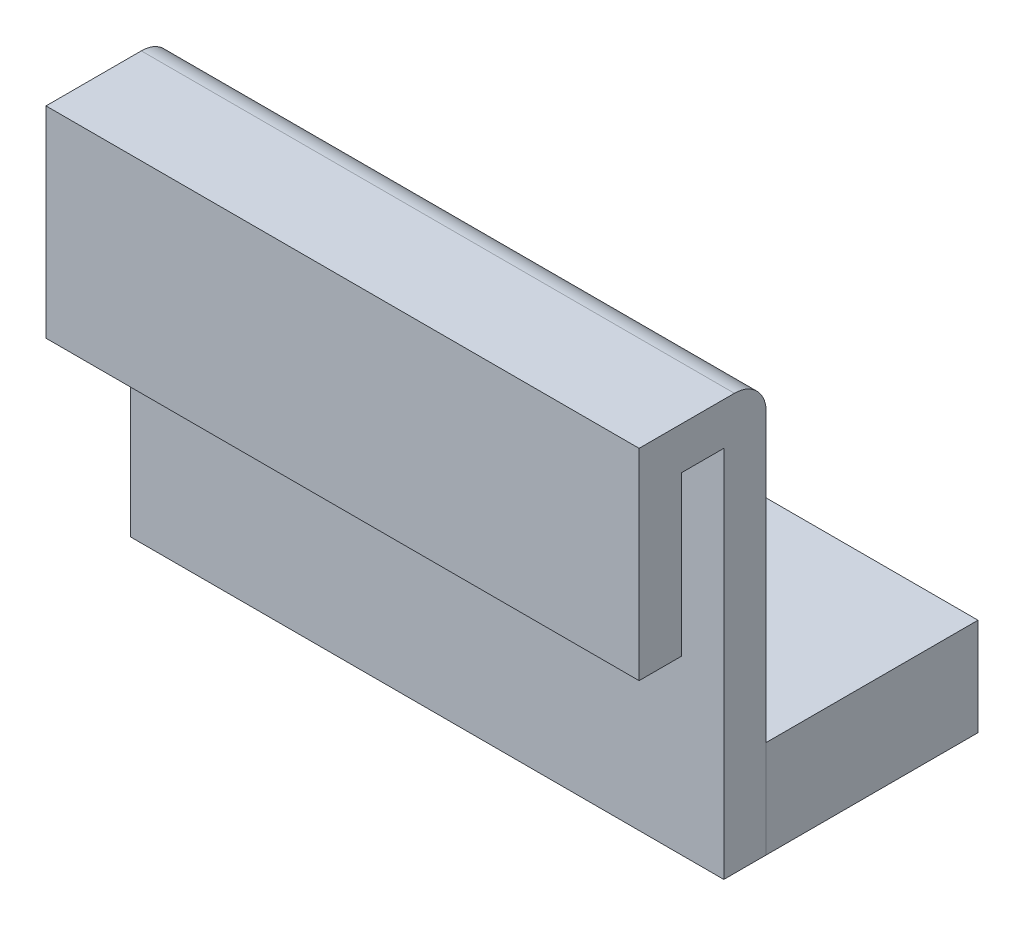
ISO-10303-21;
HEADER;
FILE_DESCRIPTION(('STEP AP214'),'2;1');
FILE_NAME('part.step','',(''),(''),'','','');
FILE_SCHEMA(('AUTOMOTIVE_DESIGN { 1 0 10303 214 1 1 1 1 }'));
ENDSEC;
DATA;
#1=APPLICATION_CONTEXT('core data for automotive mechanical design processes');
#2=APPLICATION_PROTOCOL_DEFINITION('international standard','automotive_design',2000,#1);
#3=PRODUCT_CONTEXT('',#1,'mechanical');
#4=PRODUCT('Part','Part','',(#3));
#5=PRODUCT_RELATED_PRODUCT_CATEGORY('part','',(#4));
#6=PRODUCT_DEFINITION_FORMATION('','',#4);
#7=PRODUCT_DEFINITION_CONTEXT('part definition',#1,'design');
#8=PRODUCT_DEFINITION('design','',#6,#7);
#9=PRODUCT_DEFINITION_SHAPE('','',#8);
#10=(LENGTH_UNIT() NAMED_UNIT(*) SI_UNIT(.MILLI.,.METRE.));
#11=(NAMED_UNIT(*) PLANE_ANGLE_UNIT() SI_UNIT($,.RADIAN.));
#12=(NAMED_UNIT(*) SI_UNIT($,.STERADIAN.) SOLID_ANGLE_UNIT());
#13=UNCERTAINTY_MEASURE_WITH_UNIT(LENGTH_MEASURE(1.E-05),#10,'distance_accuracy_value','');
#14=(GEOMETRIC_REPRESENTATION_CONTEXT(3) GLOBAL_UNCERTAINTY_ASSIGNED_CONTEXT((#13)) GLOBAL_UNIT_ASSIGNED_CONTEXT((#10,
#11,#12)) REPRESENTATION_CONTEXT('',''));
#15=CARTESIAN_POINT('',(0.,0.,0.));
#16=DIRECTION('',(0.,0.,1.));
#17=DIRECTION('',(1.,0.,0.));
#18=AXIS2_PLACEMENT_3D('',#15,#16,#17);
#19=CARTESIAN_POINT('',(-280.,306.56,280.));
#20=DIRECTION('',(0.,1.,0.));
#21=DIRECTION('',(0.,0.,1.));
#22=AXIS2_PLACEMENT_3D('',#19,#20,#21);
#23=PLANE('',#22);
#24=DIRECTION('',(1.,0.,0.));
#25=VECTOR('',#24,1.);
#26=CARTESIAN_POINT('',(-280.,306.56,280.));
#27=LINE('',#26,#25);
#28=CARTESIAN_POINT('',(-280.,306.56,280.));
#29=VERTEX_POINT('',#28);
#30=CARTESIAN_POINT('',(280.,306.56,280.));
#31=VERTEX_POINT('',#30);
#32=EDGE_CURVE('E138',#29,#31,#27,.T.);
#33=ORIENTED_EDGE('',*,*,#32,.F.);
#34=DIRECTION('',(0.,0.,-1.));
#35=VECTOR('',#34,1.);
#36=CARTESIAN_POINT('',(-280.,306.56,280.));
#37=LINE('',#36,#35);
#38=CARTESIAN_POINT('',(-280.,306.56,240.));
#39=VERTEX_POINT('',#38);
#40=EDGE_CURVE('E143',#29,#39,#37,.T.);
#41=ORIENTED_EDGE('',*,*,#40,.T.);
#42=DIRECTION('',(1.,0.,0.));
#43=VECTOR('',#42,1.);
#44=CARTESIAN_POINT('',(-280.,306.56,240.));
#45=LINE('',#44,#43);
#46=CARTESIAN_POINT('',(280.,306.56,240.));
#47=VERTEX_POINT('',#46);
#48=EDGE_CURVE('E156',#39,#47,#45,.T.);
#49=ORIENTED_EDGE('',*,*,#48,.T.);
#50=DIRECTION('',(0.,0.,-1.));
#51=VECTOR('',#50,1.);
#52=CARTESIAN_POINT('',(280.,306.56,280.));
#53=LINE('',#52,#51);
#54=EDGE_CURVE('E159',#31,#47,#53,.T.);
#55=ORIENTED_EDGE('',*,*,#54,.F.);
#56=EDGE_LOOP('',(#33,#41,#49,#55));
#57=FACE_BOUND('',#56,.T.);
#58=ADVANCED_FACE('F49',(#57),#23,.F.);
#59=CARTESIAN_POINT('',(0.,0.,240.));
#60=DIRECTION('',(0.,0.,-1.));
#61=DIRECTION('',(-1.,0.,0.));
#62=AXIS2_PLACEMENT_3D('',#59,#60,#61);
#63=PLANE('',#62);
#64=ORIENTED_EDGE('',*,*,#48,.F.);
#65=DIRECTION('',(0.,-1.,0.));
#66=VECTOR('',#65,1.);
#67=CARTESIAN_POINT('',(-280.,-46.,240.));
#68=LINE('',#67,#66);
#69=CARTESIAN_POINT('',(-280.,-46.,240.));
#70=VERTEX_POINT('',#69);
#71=EDGE_CURVE('E168',#39,#70,#68,.T.);
#72=ORIENTED_EDGE('',*,*,#71,.T.);
#73=DIRECTION('',(1.,0.,0.));
#74=VECTOR('',#73,1.);
#75=CARTESIAN_POINT('',(-280.,-46.,240.));
#76=LINE('',#75,#74);
#77=CARTESIAN_POINT('',(280.,-46.,240.));
#78=VERTEX_POINT('',#77);
#79=EDGE_CURVE('E170',#70,#78,#76,.T.);
#80=ORIENTED_EDGE('',*,*,#79,.T.);
#81=DIRECTION('',(0.,1.,0.));
#82=VECTOR('',#81,1.);
#83=CARTESIAN_POINT('',(280.,-46.,240.));
#84=LINE('',#83,#82);
#85=EDGE_CURVE('E173',#78,#47,#84,.T.);
#86=ORIENTED_EDGE('',*,*,#85,.T.);
#87=EDGE_LOOP('',(#64,#72,#80,#86));
#88=FACE_BOUND('',#87,.T.);
#89=ADVANCED_FACE('F206',(#88),#63,.F.);
#90=CARTESIAN_POINT('',(-280.,-46.,240.));
#91=DIRECTION('',(1.,0.,0.));
#92=DIRECTION('',(0.,0.,-1.));
#93=AXIS2_PLACEMENT_3D('',#90,#91,#92);
#94=PLANE('',#93);
#95=DIRECTION('',(0.,0.,1.));
#96=VECTOR('',#95,1.);
#97=CARTESIAN_POINT('',(-280.,346.56,200.));
#98=LINE('',#97,#96);
#99=CARTESIAN_POINT('',(-280.,346.56,230.));
#100=VERTEX_POINT('',#99);
#101=CARTESIAN_POINT('',(-280.,346.56,320.));
#102=VERTEX_POINT('',#101);
#103=EDGE_CURVE('E162',#100,#102,#98,.T.);
#104=ORIENTED_EDGE('',*,*,#103,.F.);
#105=CARTESIAN_POINT('',(-280.,316.56,230.));
#106=DIRECTION('',(1.,0.,0.));
#107=DIRECTION('',(0.,0.,-1.));
#108=AXIS2_PLACEMENT_3D('',#105,#106,#107);
#109=CIRCLE('',#108,30.);
#110=CARTESIAN_POINT('',(-280.,316.56,200.));
#111=VERTEX_POINT('',#110);
#112=EDGE_CURVE('E71',#100,#111,#109,.F.);
#113=ORIENTED_EDGE('',*,*,#112,.T.);
#114=DIRECTION('',(0.,-1.,0.));
#115=VECTOR('',#114,1.);
#116=CARTESIAN_POINT('',(-280.,-46.,200.));
#117=LINE('',#116,#115);
#118=CARTESIAN_POINT('',(-280.,-46.,200.));
#119=VERTEX_POINT('',#118);
#120=EDGE_CURVE('E167',#111,#119,#117,.T.);
#121=ORIENTED_EDGE('',*,*,#120,.T.);
#122=DIRECTION('',(0.,0.,-1.));
#123=VECTOR('',#122,1.);
#124=CARTESIAN_POINT('',(-280.,-46.,240.));
#125=LINE('',#124,#123);
#126=EDGE_CURVE('E183',#70,#119,#125,.T.);
#127=ORIENTED_EDGE('',*,*,#126,.F.);
#128=ORIENTED_EDGE('',*,*,#71,.F.);
#129=ORIENTED_EDGE('',*,*,#40,.F.);
#130=DIRECTION('',(0.,1.,0.));
#131=VECTOR('',#130,1.);
#132=CARTESIAN_POINT('',(-280.,156.56,280.));
#133=LINE('',#132,#131);
#134=CARTESIAN_POINT('',(-280.,156.56,280.));
#135=VERTEX_POINT('',#134);
#136=EDGE_CURVE('E122',#135,#29,#133,.T.);
#137=ORIENTED_EDGE('',*,*,#136,.F.);
#138=DIRECTION('',(0.,0.,-1.));
#139=VECTOR('',#138,1.);
#140=CARTESIAN_POINT('',(-280.,156.56,320.));
#141=LINE('',#140,#139);
#142=CARTESIAN_POINT('',(-280.,156.56,320.));
#143=VERTEX_POINT('',#142);
#144=EDGE_CURVE('E130',#143,#135,#141,.T.);
#145=ORIENTED_EDGE('',*,*,#144,.F.);
#146=DIRECTION('',(0.,-1.,0.));
#147=VECTOR('',#146,1.);
#148=CARTESIAN_POINT('',(-280.,346.56,320.));
#149=LINE('',#148,#147);
#150=EDGE_CURVE('E144',#102,#143,#149,.T.);
#151=ORIENTED_EDGE('',*,*,#150,.F.);
#152=EDGE_LOOP('',(#104,#113,#121,#127,#128,#129,#137,#145,#151));
#153=FACE_BOUND('',#152,.T.);
#154=ADVANCED_FACE('F141',(#153),#94,.F.);
#155=CARTESIAN_POINT('',(-280.,-46.,240.));
#156=DIRECTION('',(0.,1.,0.));
#157=DIRECTION('',(0.,0.,1.));
#158=AXIS2_PLACEMENT_3D('',#155,#156,#157);
#159=PLANE('',#158);
#160=DIRECTION('',(1.,0.,0.));
#161=VECTOR('',#160,1.);
#162=CARTESIAN_POINT('',(-280.,-46.,200.));
#163=LINE('',#162,#161);
#164=CARTESIAN_POINT('',(280.,-46.,200.));
#165=VERTEX_POINT('',#164);
#166=EDGE_CURVE('E178',#119,#165,#163,.T.);
#167=ORIENTED_EDGE('',*,*,#166,.T.);
#168=DIRECTION('',(0.,0.,-1.));
#169=VECTOR('',#168,1.);
#170=CARTESIAN_POINT('',(280.,-46.,240.));
#171=LINE('',#170,#169);
#172=EDGE_CURVE('E176',#78,#165,#171,.T.);
#173=ORIENTED_EDGE('',*,*,#172,.F.);
#174=ORIENTED_EDGE('',*,*,#79,.F.);
#175=ORIENTED_EDGE('',*,*,#126,.T.);
#176=EDGE_LOOP('',(#167,#173,#174,#175));
#177=FACE_BOUND('',#176,.T.);
#178=ADVANCED_FACE('F211',(#177),#159,.F.);
#179=CARTESIAN_POINT('',(280.,-46.,240.));
#180=DIRECTION('',(-1.,0.,0.));
#181=DIRECTION('',(0.,0.,1.));
#182=AXIS2_PLACEMENT_3D('',#179,#180,#181);
#183=PLANE('',#182);
#184=DIRECTION('',(0.,1.,0.));
#185=VECTOR('',#184,1.);
#186=CARTESIAN_POINT('',(280.,-46.,200.));
#187=LINE('',#186,#185);
#188=CARTESIAN_POINT('',(280.,316.56,200.));
#189=VERTEX_POINT('',#188);
#190=EDGE_CURVE('E171',#165,#189,#187,.T.);
#191=ORIENTED_EDGE('',*,*,#190,.T.);
#192=CARTESIAN_POINT('',(280.,316.56,230.));
#193=DIRECTION('',(-1.,0.,0.));
#194=DIRECTION('',(0.,0.,1.));
#195=AXIS2_PLACEMENT_3D('',#192,#193,#194);
#196=CIRCLE('',#195,30.);
#197=CARTESIAN_POINT('',(280.,346.56,230.));
#198=VERTEX_POINT('',#197);
#199=EDGE_CURVE('E12',#189,#198,#196,.F.);
#200=ORIENTED_EDGE('',*,*,#199,.T.);
#201=DIRECTION('',(0.,0.,-1.));
#202=VECTOR('',#201,1.);
#203=CARTESIAN_POINT('',(280.,346.56,200.));
#204=LINE('',#203,#202);
#205=CARTESIAN_POINT('',(280.,346.56,320.));
#206=VERTEX_POINT('',#205);
#207=EDGE_CURVE('E164',#206,#198,#204,.T.);
#208=ORIENTED_EDGE('',*,*,#207,.F.);
#209=DIRECTION('',(0.,1.,0.));
#210=VECTOR('',#209,1.);
#211=CARTESIAN_POINT('',(280.,346.56,320.));
#212=LINE('',#211,#210);
#213=CARTESIAN_POINT('',(280.,156.56,320.));
#214=VERTEX_POINT('',#213);
#215=EDGE_CURVE('E146',#214,#206,#212,.T.);
#216=ORIENTED_EDGE('',*,*,#215,.F.);
#217=DIRECTION('',(0.,0.,1.));
#218=VECTOR('',#217,1.);
#219=CARTESIAN_POINT('',(280.,156.56,320.));
#220=LINE('',#219,#218);
#221=CARTESIAN_POINT('',(280.,156.56,280.));
#222=VERTEX_POINT('',#221);
#223=EDGE_CURVE('E129',#222,#214,#220,.T.);
#224=ORIENTED_EDGE('',*,*,#223,.F.);
#225=DIRECTION('',(0.,1.,0.));
#226=VECTOR('',#225,1.);
#227=CARTESIAN_POINT('',(280.,156.56,280.));
#228=LINE('',#227,#226);
#229=EDGE_CURVE('E125',#222,#31,#228,.T.);
#230=ORIENTED_EDGE('',*,*,#229,.T.);
#231=ORIENTED_EDGE('',*,*,#54,.T.);
#232=ORIENTED_EDGE('',*,*,#85,.F.);
#233=ORIENTED_EDGE('',*,*,#172,.T.);
#234=EDGE_LOOP('',(#191,#200,#208,#216,#224,#230,#231,#232,#233));
#235=FACE_BOUND('',#234,.T.);
#236=ADVANCED_FACE('F198',(#235),#183,.F.);
#237=CARTESIAN_POINT('',(0.,0.,200.));
#238=DIRECTION('',(0.,0.,-1.));
#239=DIRECTION('',(-1.,0.,0.));
#240=AXIS2_PLACEMENT_3D('',#237,#238,#239);
#241=PLANE('',#240);
#242=ORIENTED_EDGE('',*,*,#120,.F.);
#243=DIRECTION('',(-1.,0.,0.));
#244=VECTOR('',#243,1.);
#245=CARTESIAN_POINT('',(0.,316.56,200.));
#246=LINE('',#245,#244);
#247=EDGE_CURVE('E57',#111,#189,#246,.F.);
#248=ORIENTED_EDGE('',*,*,#247,.T.);
#249=ORIENTED_EDGE('',*,*,#190,.F.);
#250=ORIENTED_EDGE('',*,*,#166,.F.);
#251=EDGE_LOOP('',(#242,#248,#249,#250));
#252=FACE_BOUND('',#251,.T.);
#253=ADVANCED_FACE('F213',(#252),#241,.T.);
#254=CARTESIAN_POINT('',(0.,346.56,0.));
#255=DIRECTION('',(0.,1.,0.));
#256=DIRECTION('',(0.,0.,1.));
#257=AXIS2_PLACEMENT_3D('',#254,#255,#256);
#258=PLANE('',#257);
#259=ORIENTED_EDGE('',*,*,#207,.T.);
#260=DIRECTION('',(-1.,0.,0.));
#261=VECTOR('',#260,1.);
#262=CARTESIAN_POINT('',(0.,346.56,230.));
#263=LINE('',#262,#261);
#264=EDGE_CURVE('E186',#198,#100,#263,.T.);
#265=ORIENTED_EDGE('',*,*,#264,.T.);
#266=ORIENTED_EDGE('',*,*,#103,.T.);
#267=DIRECTION('',(-1.,0.,0.));
#268=VECTOR('',#267,1.);
#269=CARTESIAN_POINT('',(-280.,346.56,320.));
#270=LINE('',#269,#268);
#271=EDGE_CURVE('E153',#206,#102,#270,.T.);
#272=ORIENTED_EDGE('',*,*,#271,.F.);
#273=EDGE_LOOP('',(#259,#265,#266,#272));
#274=FACE_BOUND('',#273,.T.);
#275=ADVANCED_FACE('F191',(#274),#258,.T.);
#276=CARTESIAN_POINT('',(0.,316.56,230.));
#277=DIRECTION('',(-1.,0.,0.));
#278=DIRECTION('',(0.,0.,1.));
#279=AXIS2_PLACEMENT_3D('',#276,#277,#278);
#280=CYLINDRICAL_SURFACE('',#279,30.);
#281=ORIENTED_EDGE('',*,*,#199,.F.);
#282=ORIENTED_EDGE('',*,*,#247,.F.);
#283=ORIENTED_EDGE('',*,*,#112,.F.);
#284=ORIENTED_EDGE('',*,*,#264,.F.);
#285=EDGE_LOOP('',(#281,#282,#283,#284));
#286=FACE_BOUND('',#285,.T.);
#287=ADVANCED_FACE('F51',(#286),#280,.T.);
#288=CARTESIAN_POINT('',(0.,0.,320.));
#289=DIRECTION('',(0.,0.,1.));
#290=DIRECTION('',(1.,0.,0.));
#291=AXIS2_PLACEMENT_3D('',#288,#289,#290);
#292=PLANE('',#291);
#293=ORIENTED_EDGE('',*,*,#150,.T.);
#294=DIRECTION('',(-1.,0.,0.));
#295=VECTOR('',#294,1.);
#296=CARTESIAN_POINT('',(-280.,156.56,320.));
#297=LINE('',#296,#295);
#298=EDGE_CURVE('E136',#214,#143,#297,.T.);
#299=ORIENTED_EDGE('',*,*,#298,.F.);
#300=ORIENTED_EDGE('',*,*,#215,.T.);
#301=ORIENTED_EDGE('',*,*,#271,.T.);
#302=EDGE_LOOP('',(#293,#299,#300,#301));
#303=FACE_BOUND('',#302,.T.);
#304=ADVANCED_FACE('F196',(#303),#292,.T.);
#305=CARTESIAN_POINT('',(-280.,156.56,280.));
#306=DIRECTION('',(0.,0.,1.));
#307=DIRECTION('',(1.,0.,0.));
#308=AXIS2_PLACEMENT_3D('',#305,#306,#307);
#309=PLANE('',#308);
#310=ORIENTED_EDGE('',*,*,#32,.T.);
#311=ORIENTED_EDGE('',*,*,#229,.F.);
#312=DIRECTION('',(1.,0.,0.));
#313=VECTOR('',#312,1.);
#314=CARTESIAN_POINT('',(-280.,156.56,280.));
#315=LINE('',#314,#313);
#316=EDGE_CURVE('E118',#135,#222,#315,.T.);
#317=ORIENTED_EDGE('',*,*,#316,.F.);
#318=ORIENTED_EDGE('',*,*,#136,.T.);
#319=EDGE_LOOP('',(#310,#311,#317,#318));
#320=FACE_BOUND('',#319,.T.);
#321=ADVANCED_FACE('F120',(#320),#309,.F.);
#322=CARTESIAN_POINT('',(0.,156.56,0.));
#323=DIRECTION('',(0.,-1.,0.));
#324=DIRECTION('',(0.,0.,-1.));
#325=AXIS2_PLACEMENT_3D('',#322,#323,#324);
#326=PLANE('',#325);
#327=ORIENTED_EDGE('',*,*,#144,.T.);
#328=ORIENTED_EDGE('',*,*,#316,.T.);
#329=ORIENTED_EDGE('',*,*,#223,.T.);
#330=ORIENTED_EDGE('',*,*,#298,.T.);
#331=EDGE_LOOP('',(#327,#328,#329,#330));
#332=FACE_BOUND('',#331,.T.);
#333=ADVANCED_FACE('F134',(#332),#326,.T.);
#334=CLOSED_SHELL('',(#58,#89,#154,#178,#236,#253,#275,#287,#304,#321,#333));
#335=MANIFOLD_SOLID_BREP('B2',#334);
#336=CARTESIAN_POINT('',(280.,46.,200.));
#337=DIRECTION('',(-1.,0.,0.));
#338=DIRECTION('',(0.,0.,1.));
#339=AXIS2_PLACEMENT_3D('',#336,#337,#338);
#340=PLANE('',#339);
#341=DIRECTION('',(0.,1.,0.));
#342=VECTOR('',#341,1.);
#343=CARTESIAN_POINT('',(280.,46.,0.));
#344=LINE('',#343,#342);
#345=CARTESIAN_POINT('',(280.,-46.,0.));
#346=VERTEX_POINT('',#345);
#347=CARTESIAN_POINT('',(280.,46.,0.));
#348=VERTEX_POINT('',#347);
#349=EDGE_CURVE('E409',#346,#348,#344,.T.);
#350=ORIENTED_EDGE('',*,*,#349,.T.);
#351=DIRECTION('',(0.,0.,-1.));
#352=VECTOR('',#351,1.);
#353=CARTESIAN_POINT('',(280.,46.,200.));
#354=LINE('',#353,#352);
#355=CARTESIAN_POINT('',(280.,46.,200.));
#356=VERTEX_POINT('',#355);
#357=EDGE_CURVE('E47',#356,#348,#354,.T.);
#358=ORIENTED_EDGE('',*,*,#357,.F.);
#359=DIRECTION('',(0.,1.,0.));
#360=VECTOR('',#359,1.);
#361=CARTESIAN_POINT('',(280.,46.,200.));
#362=LINE('',#361,#360);
#363=CARTESIAN_POINT('',(280.,-46.,200.));
#364=VERTEX_POINT('',#363);
#365=EDGE_CURVE('E396',#364,#356,#362,.T.);
#366=ORIENTED_EDGE('',*,*,#365,.F.);
#367=DIRECTION('',(0.,0.,-1.));
#368=VECTOR('',#367,1.);
#369=CARTESIAN_POINT('',(280.,-46.,200.));
#370=LINE('',#369,#368);
#371=EDGE_CURVE('E405',#364,#346,#370,.T.);
#372=ORIENTED_EDGE('',*,*,#371,.T.);
#373=EDGE_LOOP('',(#350,#358,#366,#372));
#374=FACE_BOUND('',#373,.T.);
#375=ADVANCED_FACE('F344',(#374),#340,.F.);
#376=CARTESIAN_POINT('',(-280.,46.,200.));
#377=DIRECTION('',(0.,-1.,0.));
#378=DIRECTION('',(0.,0.,-1.));
#379=AXIS2_PLACEMENT_3D('',#376,#377,#378);
#380=PLANE('',#379);
#381=DIRECTION('',(-1.,0.,0.));
#382=VECTOR('',#381,1.);
#383=CARTESIAN_POINT('',(-280.,46.,0.));
#384=LINE('',#383,#382);
#385=CARTESIAN_POINT('',(-280.,46.,0.));
#386=VERTEX_POINT('',#385);
#387=EDGE_CURVE('E400',#348,#386,#384,.T.);
#388=ORIENTED_EDGE('',*,*,#387,.T.);
#389=DIRECTION('',(0.,0.,-1.));
#390=VECTOR('',#389,1.);
#391=CARTESIAN_POINT('',(-280.,46.,200.));
#392=LINE('',#391,#390);
#393=CARTESIAN_POINT('',(-280.,46.,200.));
#394=VERTEX_POINT('',#393);
#395=EDGE_CURVE('E353',#394,#386,#392,.T.);
#396=ORIENTED_EDGE('',*,*,#395,.F.);
#397=DIRECTION('',(-1.,0.,0.));
#398=VECTOR('',#397,1.);
#399=CARTESIAN_POINT('',(-280.,46.,200.));
#400=LINE('',#399,#398);
#401=EDGE_CURVE('E391',#356,#394,#400,.T.);
#402=ORIENTED_EDGE('',*,*,#401,.F.);
#403=ORIENTED_EDGE('',*,*,#357,.T.);
#404=EDGE_LOOP('',(#388,#396,#402,#403));
#405=FACE_BOUND('',#404,.T.);
#406=ADVANCED_FACE('F399',(#405),#380,.F.);
#407=CARTESIAN_POINT('',(-280.,46.,200.));
#408=DIRECTION('',(1.,0.,0.));
#409=DIRECTION('',(0.,0.,-1.));
#410=AXIS2_PLACEMENT_3D('',#407,#408,#409);
#411=PLANE('',#410);
#412=DIRECTION('',(0.,-1.,0.));
#413=VECTOR('',#412,1.);
#414=CARTESIAN_POINT('',(-280.,46.,0.));
#415=LINE('',#414,#413);
#416=CARTESIAN_POINT('',(-280.,-46.,0.));
#417=VERTEX_POINT('',#416);
#418=EDGE_CURVE('E378',#386,#417,#415,.T.);
#419=ORIENTED_EDGE('',*,*,#418,.T.);
#420=DIRECTION('',(0.,0.,-1.));
#421=VECTOR('',#420,1.);
#422=CARTESIAN_POINT('',(-280.,-46.,200.));
#423=LINE('',#422,#421);
#424=CARTESIAN_POINT('',(-280.,-46.,200.));
#425=VERTEX_POINT('',#424);
#426=EDGE_CURVE('E401',#425,#417,#423,.T.);
#427=ORIENTED_EDGE('',*,*,#426,.F.);
#428=DIRECTION('',(0.,-1.,0.));
#429=VECTOR('',#428,1.);
#430=CARTESIAN_POINT('',(-280.,46.,200.));
#431=LINE('',#430,#429);
#432=EDGE_CURVE('E394',#394,#425,#431,.T.);
#433=ORIENTED_EDGE('',*,*,#432,.F.);
#434=ORIENTED_EDGE('',*,*,#395,.T.);
#435=EDGE_LOOP('',(#419,#427,#433,#434));
#436=FACE_BOUND('',#435,.T.);
#437=ADVANCED_FACE('F403',(#436),#411,.F.);
#438=CARTESIAN_POINT('',(-280.,-46.,200.));
#439=DIRECTION('',(0.,1.,0.));
#440=DIRECTION('',(0.,0.,1.));
#441=AXIS2_PLACEMENT_3D('',#438,#439,#440);
#442=PLANE('',#441);
#443=DIRECTION('',(1.,0.,0.));
#444=VECTOR('',#443,1.);
#445=CARTESIAN_POINT('',(-280.,-46.,0.));
#446=LINE('',#445,#444);
#447=EDGE_CURVE('E384',#417,#346,#446,.T.);
#448=ORIENTED_EDGE('',*,*,#447,.T.);
#449=ORIENTED_EDGE('',*,*,#371,.F.);
#450=DIRECTION('',(1.,0.,0.));
#451=VECTOR('',#450,1.);
#452=CARTESIAN_POINT('',(-280.,-46.,200.));
#453=LINE('',#452,#451);
#454=EDGE_CURVE('E361',#425,#364,#453,.T.);
#455=ORIENTED_EDGE('',*,*,#454,.F.);
#456=ORIENTED_EDGE('',*,*,#426,.T.);
#457=EDGE_LOOP('',(#448,#449,#455,#456));
#458=FACE_BOUND('',#457,.T.);
#459=ADVANCED_FACE('F416',(#458),#442,.F.);
#460=CARTESIAN_POINT('',(0.,0.,200.));
#461=DIRECTION('',(0.,0.,1.));
#462=DIRECTION('',(1.,0.,0.));
#463=AXIS2_PLACEMENT_3D('',#460,#461,#462);
#464=PLANE('',#463);
#465=ORIENTED_EDGE('',*,*,#365,.T.);
#466=ORIENTED_EDGE('',*,*,#401,.T.);
#467=ORIENTED_EDGE('',*,*,#432,.T.);
#468=ORIENTED_EDGE('',*,*,#454,.T.);
#469=EDGE_LOOP('',(#465,#466,#467,#468));
#470=FACE_BOUND('',#469,.T.);
#471=ADVANCED_FACE('F392',(#470),#464,.T.);
#472=CARTESIAN_POINT('',(0.,0.,0.));
#473=DIRECTION('',(0.,0.,1.));
#474=DIRECTION('',(1.,0.,0.));
#475=AXIS2_PLACEMENT_3D('',#472,#473,#474);
#476=PLANE('',#475);
#477=CARTESIAN_POINT('',(0.,0.,0.));
#478=DIRECTION('',(0.,0.,1.));
#479=DIRECTION('',(1.,0.,0.));
#480=AXIS2_PLACEMENT_3D('',#477,#478,#479);
#481=CIRCLE('',#480,15.);
#482=CARTESIAN_POINT('',(15.,0.,0.));
#483=VERTEX_POINT('',#482);
#484=EDGE_CURVE('E347',#483,#483,#481,.F.);
#485=ORIENTED_EDGE('',*,*,#484,.F.);
#486=EDGE_LOOP('',(#485));
#487=FACE_BOUND('',#486,.T.);
#488=ORIENTED_EDGE('',*,*,#349,.F.);
#489=ORIENTED_EDGE('',*,*,#447,.F.);
#490=ORIENTED_EDGE('',*,*,#418,.F.);
#491=ORIENTED_EDGE('',*,*,#387,.F.);
#492=EDGE_LOOP('',(#488,#489,#490,#491));
#493=FACE_BOUND('',#492,.T.);
#494=ADVANCED_FACE('F419',(#487,#493),#476,.F.);
#495=CARTESIAN_POINT('',(0.,0.,-1.2E-05));
#496=DIRECTION('',(0.,0.,1.));
#497=DIRECTION('',(1.,0.,0.));
#498=AXIS2_PLACEMENT_3D('',#495,#496,#497);
#499=CYLINDRICAL_SURFACE('',#498,15.);
#500=CARTESIAN_POINT('',(0.,0.,5.));
#501=DIRECTION('',(0.,0.,-1.));
#502=DIRECTION('',(-1.,0.,0.));
#503=AXIS2_PLACEMENT_3D('',#500,#501,#502);
#504=CIRCLE('',#503,15.);
#505=CARTESIAN_POINT('',(15.,0.,5.));
#506=VERTEX_POINT('',#505);
#507=EDGE_CURVE('E422',#506,#506,#504,.T.);
#508=CARTESIAN_POINT('',(15.,0.,5.));
#509=CARTESIAN_POINT('',(15.,0.,4.94791666666667));
#510=CARTESIAN_POINT('',(15.,0.,4.89583333333333));
#511=CARTESIAN_POINT('',(15.,0.,4.79166666666667));
#512=CARTESIAN_POINT('',(15.,0.,4.73958333333333));
#513=CARTESIAN_POINT('',(15.,0.,4.63541666666667));
#514=CARTESIAN_POINT('',(15.,0.,4.58333333333333));
#515=CARTESIAN_POINT('',(15.,0.,4.47916666666667));
#516=CARTESIAN_POINT('',(15.,0.,4.42708333333333));
#517=CARTESIAN_POINT('',(15.,0.,4.32291666666667));
#518=CARTESIAN_POINT('',(15.,0.,4.27083333333333));
#519=CARTESIAN_POINT('',(15.,0.,4.16666666666667));
#520=CARTESIAN_POINT('',(15.,0.,4.11458333333333));
#521=CARTESIAN_POINT('',(15.,0.,4.01041666666667));
#522=CARTESIAN_POINT('',(15.,0.,3.95833333333333));
#523=CARTESIAN_POINT('',(15.,0.,3.85416666666667));
#524=CARTESIAN_POINT('',(15.,0.,3.80208333333333));
#525=CARTESIAN_POINT('',(15.,0.,3.69791666666667));
#526=CARTESIAN_POINT('',(15.,0.,3.64583333333333));
#527=CARTESIAN_POINT('',(15.,0.,3.54166666666667));
#528=CARTESIAN_POINT('',(15.,0.,3.48958333333333));
#529=CARTESIAN_POINT('',(15.,0.,3.38541666666667));
#530=CARTESIAN_POINT('',(15.,0.,3.33333333333333));
#531=CARTESIAN_POINT('',(15.,0.,3.22916666666667));
#532=CARTESIAN_POINT('',(15.,0.,3.17708333333333));
#533=CARTESIAN_POINT('',(15.,0.,3.07291666666667));
#534=CARTESIAN_POINT('',(15.,0.,3.02083333333333));
#535=CARTESIAN_POINT('',(15.,0.,2.91666666666667));
#536=CARTESIAN_POINT('',(15.,0.,2.86458333333333));
#537=CARTESIAN_POINT('',(15.,0.,2.76041666666667));
#538=CARTESIAN_POINT('',(15.,0.,2.70833333333333));
#539=CARTESIAN_POINT('',(15.,0.,2.60416666666667));
#540=CARTESIAN_POINT('',(15.,0.,2.55208333333333));
#541=CARTESIAN_POINT('',(15.,0.,2.44791666666667));
#542=CARTESIAN_POINT('',(15.,0.,2.39583333333333));
#543=CARTESIAN_POINT('',(15.,0.,2.29166666666667));
#544=CARTESIAN_POINT('',(15.,0.,2.23958333333333));
#545=CARTESIAN_POINT('',(15.,0.,2.13541666666667));
#546=CARTESIAN_POINT('',(15.,0.,2.08333333333333));
#547=CARTESIAN_POINT('',(15.,0.,1.97916666666667));
#548=CARTESIAN_POINT('',(15.,0.,1.92708333333333));
#549=CARTESIAN_POINT('',(15.,0.,1.82291666666667));
#550=CARTESIAN_POINT('',(15.,0.,1.77083333333333));
#551=CARTESIAN_POINT('',(15.,0.,1.66666666666667));
#552=CARTESIAN_POINT('',(15.,0.,1.61458333333333));
#553=CARTESIAN_POINT('',(15.,0.,1.51041666666667));
#554=CARTESIAN_POINT('',(15.,0.,1.45833333333333));
#555=CARTESIAN_POINT('',(15.,0.,1.35416666666667));
#556=CARTESIAN_POINT('',(15.,0.,1.30208333333333));
#557=CARTESIAN_POINT('',(15.,0.,1.19791666666667));
#558=CARTESIAN_POINT('',(15.,0.,1.14583333333333));
#559=CARTESIAN_POINT('',(15.,0.,1.04166666666667));
#560=CARTESIAN_POINT('',(15.,0.,0.989583333333333));
#561=CARTESIAN_POINT('',(15.,0.,0.885416666666667));
#562=CARTESIAN_POINT('',(15.,0.,0.833333333333333));
#563=CARTESIAN_POINT('',(15.,0.,0.729166666666667));
#564=CARTESIAN_POINT('',(15.,0.,0.677083333333334));
#565=CARTESIAN_POINT('',(15.,0.,0.572916666666667));
#566=CARTESIAN_POINT('',(15.,0.,0.520833333333333));
#567=CARTESIAN_POINT('',(15.,0.,0.416666666666667));
#568=CARTESIAN_POINT('',(15.,0.,0.364583333333333));
#569=CARTESIAN_POINT('',(15.,0.,0.260416666666667));
#570=CARTESIAN_POINT('',(15.,0.,0.208333333333333));
#571=CARTESIAN_POINT('',(15.,0.,0.104166666666667));
#572=CARTESIAN_POINT('',(15.,0.,0.0520833333333332));
#573=CARTESIAN_POINT('',(15.,0.,0.));
#574=B_SPLINE_CURVE_WITH_KNOTS('',3,(#508,#509,#510,#511,#512,#513,#514,#515,#516,#517,#518,
#519,#520,#521,#522,#523,#524,#525,#526,#527,#528,#529,#530,#531,#532,#533,#534,#535,#536,#537,
#538,#539,#540,#541,#542,#543,#544,#545,#546,#547,#548,#549,#550,#551,#552,#553,#554,#555,#556,
#557,#558,#559,#560,#561,#562,#563,#564,#565,#566,#567,#568,#569,#570,#571,#572,#573),
.UNSPECIFIED.,.F.,.F.,(4,2,2,2,2,2,2,2,2,2,2,2,2,2,2,2,2,2,2,2,2,2,2,2,2,2,2,2,2,2,2,2,4),(0.,
0.15625,0.3125,0.46875,0.625000000000001,0.781250000000001,0.937500000000001,1.09375,1.25,
1.40625,1.5625,1.71875,1.875,2.03125,2.1875,2.34375,2.5,2.65625,2.8125,2.96875,3.125,3.28125,
3.4375,3.59375,3.75,3.90625,4.0625,4.21875,4.375,4.53125,4.6875,4.84375,5.),.UNSPECIFIED.);
#575=EDGE_CURVE('BSEAM429',#506,#483,#574,.T.);
#576=ORIENTED_EDGE('',*,*,#507,.F.);
#577=ORIENTED_EDGE('',*,*,#484,.T.);
#578=ORIENTED_EDGE('',*,*,#575,.T.);
#579=ORIENTED_EDGE('',*,*,#575,.F.);
#580=EDGE_LOOP('',(#576,#578,#577,#579));
#581=FACE_BOUND('',#580,.T.);
#582=ADVANCED_FACE('F429',(#581),#499,.F.);
#583=CARTESIAN_POINT('',(0.,0.,5.));
#584=DIRECTION('',(0.,0.,-1.));
#585=DIRECTION('',(-1.,0.,0.));
#586=AXIS2_PLACEMENT_3D('',#583,#584,#585);
#587=PLANE('',#586);
#588=ORIENTED_EDGE('',*,*,#507,.T.);
#589=EDGE_LOOP('',(#588));
#590=FACE_BOUND('',#589,.T.);
#591=ADVANCED_FACE('F437',(#590),#587,.T.);
#592=CLOSED_SHELL('',(#375,#406,#437,#459,#471,#494,#582,#591));
#593=MANIFOLD_SOLID_BREP('B6',#592);
#594=ADVANCED_BREP_SHAPE_REPRESENTATION('',(#18,#335,#593),#14);
#595=SHAPE_DEFINITION_REPRESENTATION(#9,#594);
ENDSEC;
END-ISO-10303-21;
